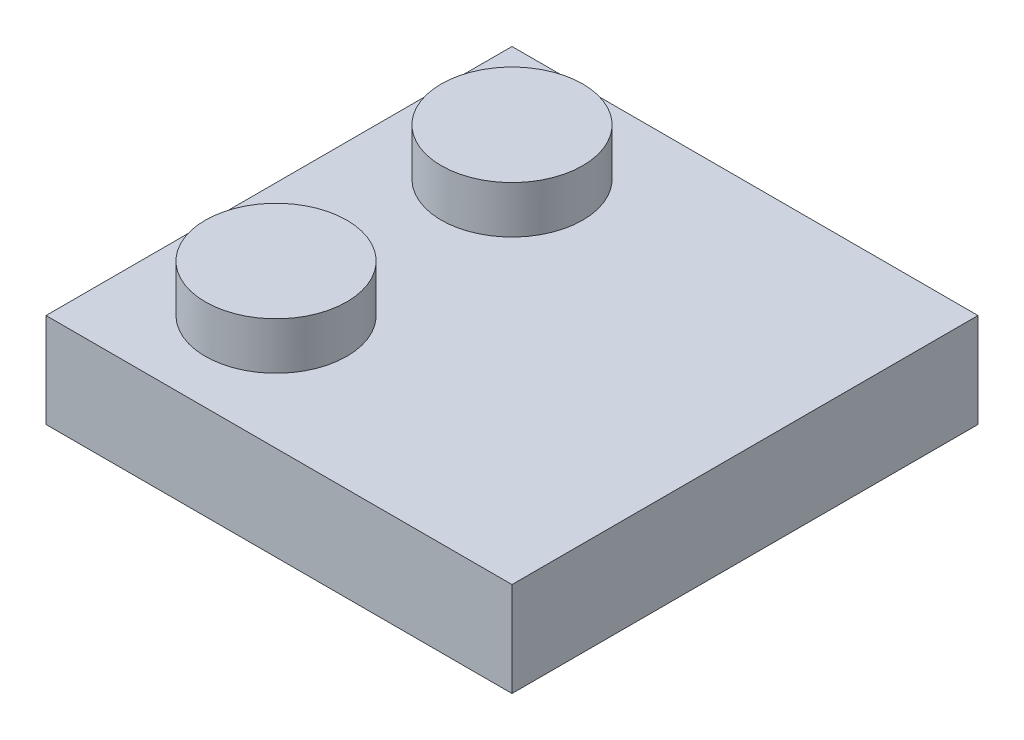
ISO-10303-21;
HEADER;
FILE_DESCRIPTION(('STEP AP214'),'2;1');
FILE_NAME('part.step','',(''),(''),'','','');
FILE_SCHEMA(('AUTOMOTIVE_DESIGN { 1 0 10303 214 1 1 1 1 }'));
ENDSEC;
DATA;
#1=APPLICATION_CONTEXT('core data for automotive mechanical design processes');
#2=APPLICATION_PROTOCOL_DEFINITION('international standard','automotive_design',2000,#1);
#3=PRODUCT_CONTEXT('',#1,'mechanical');
#4=PRODUCT('Part','Part','',(#3));
#5=PRODUCT_RELATED_PRODUCT_CATEGORY('part','',(#4));
#6=PRODUCT_DEFINITION_FORMATION('','',#4);
#7=PRODUCT_DEFINITION_CONTEXT('part definition',#1,'design');
#8=PRODUCT_DEFINITION('design','',#6,#7);
#9=PRODUCT_DEFINITION_SHAPE('','',#8);
#10=(LENGTH_UNIT() NAMED_UNIT(*) SI_UNIT(.MILLI.,.METRE.));
#11=(NAMED_UNIT(*) PLANE_ANGLE_UNIT() SI_UNIT($,.RADIAN.));
#12=(NAMED_UNIT(*) SI_UNIT($,.STERADIAN.) SOLID_ANGLE_UNIT());
#13=UNCERTAINTY_MEASURE_WITH_UNIT(LENGTH_MEASURE(1.E-05),#10,'distance_accuracy_value','');
#14=(GEOMETRIC_REPRESENTATION_CONTEXT(3) GLOBAL_UNCERTAINTY_ASSIGNED_CONTEXT((#13)) GLOBAL_UNIT_ASSIGNED_CONTEXT((#10,
#11,#12)) REPRESENTATION_CONTEXT('',''));
#15=CARTESIAN_POINT('',(0.,0.,0.));
#16=DIRECTION('',(0.,0.,1.));
#17=DIRECTION('',(1.,0.,0.));
#18=AXIS2_PLACEMENT_3D('',#15,#16,#17);
#19=CARTESIAN_POINT('',(0.681967213114738,0.,7.9));
#20=DIRECTION('',(0.,1.,0.));
#21=DIRECTION('',(0.,0.,1.));
#22=AXIS2_PLACEMENT_3D('',#19,#20,#21);
#23=PLANE('',#22);
#24=DIRECTION('',(1.,0.,0.));
#25=VECTOR('',#24,1.);
#26=CARTESIAN_POINT('',(0.681967213114738,0.,-7.9));
#27=LINE('',#26,#25);
#28=CARTESIAN_POINT('',(0.681967213114738,0.,-7.9));
#29=VERTEX_POINT('',#28);
#30=CARTESIAN_POINT('',(16.4819672131147,0.,-7.9));
#31=VERTEX_POINT('',#30);
#32=EDGE_CURVE('E187',#29,#31,#27,.T.);
#33=ORIENTED_EDGE('',*,*,#32,.T.);
#34=DIRECTION('',(0.,0.,-1.));
#35=VECTOR('',#34,1.);
#36=CARTESIAN_POINT('',(16.4819672131147,0.,7.9));
#37=LINE('',#36,#35);
#38=CARTESIAN_POINT('',(16.4819672131147,0.,7.9));
#39=VERTEX_POINT('',#38);
#40=EDGE_CURVE('E195',#39,#31,#37,.T.);
#41=ORIENTED_EDGE('',*,*,#40,.F.);
#42=DIRECTION('',(1.,0.,0.));
#43=VECTOR('',#42,1.);
#44=CARTESIAN_POINT('',(0.681967213114738,0.,7.9));
#45=LINE('',#44,#43);
#46=CARTESIAN_POINT('',(0.681967213114738,0.,7.9));
#47=VERTEX_POINT('',#46);
#48=EDGE_CURVE('E95',#47,#39,#45,.T.);
#49=ORIENTED_EDGE('',*,*,#48,.F.);
#50=DIRECTION('',(0.,0.,-1.));
#51=VECTOR('',#50,1.);
#52=CARTESIAN_POINT('',(0.681967213114738,0.,7.9));
#53=LINE('',#52,#51);
#54=EDGE_CURVE('E198',#47,#29,#53,.T.);
#55=ORIENTED_EDGE('',*,*,#54,.T.);
#56=EDGE_LOOP('',(#33,#41,#49,#55));
#57=FACE_BOUND('',#56,.T.);
#58=DIRECTION('',(1.,0.,0.));
#59=VECTOR('',#58,1.);
#60=CARTESIAN_POINT('',(0.,0.,-6.7));
#61=LINE('',#60,#59);
#62=CARTESIAN_POINT('',(1.88196721311474,0.,-6.7));
#63=VERTEX_POINT('',#62);
#64=CARTESIAN_POINT('',(15.2819672131147,0.,-6.7));
#65=VERTEX_POINT('',#64);
#66=EDGE_CURVE('E139',#63,#65,#61,.T.);
#67=ORIENTED_EDGE('',*,*,#66,.F.);
#68=DIRECTION('',(0.,0.,-1.));
#69=VECTOR('',#68,1.);
#70=CARTESIAN_POINT('',(1.88196721311474,0.,7.9));
#71=LINE('',#70,#69);
#72=CARTESIAN_POINT('',(1.88196721311474,0.,6.7));
#73=VERTEX_POINT('',#72);
#74=EDGE_CURVE('E138',#73,#63,#71,.T.);
#75=ORIENTED_EDGE('',*,*,#74,.F.);
#76=DIRECTION('',(1.,0.,0.));
#77=VECTOR('',#76,1.);
#78=CARTESIAN_POINT('',(0.,0.,6.7));
#79=LINE('',#78,#77);
#80=CARTESIAN_POINT('',(15.2819672131147,0.,6.7));
#81=VERTEX_POINT('',#80);
#82=EDGE_CURVE('E150',#73,#81,#79,.T.);
#83=ORIENTED_EDGE('',*,*,#82,.T.);
#84=DIRECTION('',(0.,0.,-1.));
#85=VECTOR('',#84,1.);
#86=CARTESIAN_POINT('',(15.2819672131147,0.,7.9));
#87=LINE('',#86,#85);
#88=EDGE_CURVE('E162',#81,#65,#87,.T.);
#89=ORIENTED_EDGE('',*,*,#88,.T.);
#90=EDGE_LOOP('',(#67,#75,#83,#89));
#91=FACE_BOUND('',#90,.T.);
#92=ADVANCED_FACE('F41',(#57,#91),#23,.F.);
#93=CARTESIAN_POINT('',(0.681967213114738,0.,7.9));
#94=DIRECTION('',(1.,0.,0.));
#95=DIRECTION('',(0.,0.,-1.));
#96=AXIS2_PLACEMENT_3D('',#93,#94,#95);
#97=PLANE('',#96);
#98=DIRECTION('',(0.,-1.,0.));
#99=VECTOR('',#98,1.);
#100=CARTESIAN_POINT('',(0.681967213114738,0.,-7.9));
#101=LINE('',#100,#99);
#102=CARTESIAN_POINT('',(0.681967213114738,3.2,-7.9));
#103=VERTEX_POINT('',#102);
#104=EDGE_CURVE('E177',#103,#29,#101,.T.);
#105=ORIENTED_EDGE('',*,*,#104,.T.);
#106=ORIENTED_EDGE('',*,*,#54,.F.);
#107=DIRECTION('',(0.,-1.,0.));
#108=VECTOR('',#107,1.);
#109=CARTESIAN_POINT('',(0.681967213114738,0.,7.9));
#110=LINE('',#109,#108);
#111=CARTESIAN_POINT('',(0.681967213114738,3.2,7.9));
#112=VERTEX_POINT('',#111);
#113=EDGE_CURVE('E178',#112,#47,#110,.T.);
#114=ORIENTED_EDGE('',*,*,#113,.F.);
#115=DIRECTION('',(0.,0.,-1.));
#116=VECTOR('',#115,1.);
#117=CARTESIAN_POINT('',(0.681967213114738,3.2,7.9));
#118=LINE('',#117,#116);
#119=EDGE_CURVE('E184',#112,#103,#118,.T.);
#120=ORIENTED_EDGE('',*,*,#119,.T.);
#121=EDGE_LOOP('',(#105,#106,#114,#120));
#122=FACE_BOUND('',#121,.T.);
#123=ADVANCED_FACE('F43',(#122),#97,.F.);
#124=CARTESIAN_POINT('',(16.4819672131147,0.,7.9));
#125=DIRECTION('',(-1.,0.,0.));
#126=DIRECTION('',(0.,0.,1.));
#127=AXIS2_PLACEMENT_3D('',#124,#125,#126);
#128=PLANE('',#127);
#129=DIRECTION('',(0.,1.,0.));
#130=VECTOR('',#129,1.);
#131=CARTESIAN_POINT('',(16.4819672131147,0.,-7.9));
#132=LINE('',#131,#130);
#133=CARTESIAN_POINT('',(16.4819672131147,3.2,-7.9));
#134=VERTEX_POINT('',#133);
#135=EDGE_CURVE('E189',#31,#134,#132,.T.);
#136=ORIENTED_EDGE('',*,*,#135,.T.);
#137=DIRECTION('',(0.,0.,-1.));
#138=VECTOR('',#137,1.);
#139=CARTESIAN_POINT('',(16.4819672131147,3.2,7.9));
#140=LINE('',#139,#138);
#141=CARTESIAN_POINT('',(16.4819672131147,3.2,7.9));
#142=VERTEX_POINT('',#141);
#143=EDGE_CURVE('E193',#142,#134,#140,.T.);
#144=ORIENTED_EDGE('',*,*,#143,.F.);
#145=DIRECTION('',(0.,1.,0.));
#146=VECTOR('',#145,1.);
#147=CARTESIAN_POINT('',(16.4819672131147,0.,7.9));
#148=LINE('',#147,#146);
#149=EDGE_CURVE('E181',#39,#142,#148,.T.);
#150=ORIENTED_EDGE('',*,*,#149,.F.);
#151=ORIENTED_EDGE('',*,*,#40,.T.);
#152=EDGE_LOOP('',(#136,#144,#150,#151));
#153=FACE_BOUND('',#152,.T.);
#154=ADVANCED_FACE('F212',(#153),#128,.F.);
#155=CARTESIAN_POINT('',(0.681967213114738,3.2,7.9));
#156=DIRECTION('',(0.,-1.,0.));
#157=DIRECTION('',(1.,0.,0.));
#158=AXIS2_PLACEMENT_3D('',#155,#156,#157);
#159=PLANE('',#158);
#160=CARTESIAN_POINT('',(4.58196721311474,3.2,4.));
#161=DIRECTION('',(0.,-1.,0.));
#162=DIRECTION('',(1.,0.,0.));
#163=AXIS2_PLACEMENT_3D('',#160,#161,#162);
#164=CIRCLE('',#163,2.4);
#165=CARTESIAN_POINT('',(6.98196721311474,3.2,4.));
#166=VERTEX_POINT('',#165);
#167=EDGE_CURVE('E50',#166,#166,#164,.F.);
#168=ORIENTED_EDGE('',*,*,#167,.F.);
#169=EDGE_LOOP('',(#168));
#170=FACE_BOUND('',#169,.T.);
#171=CARTESIAN_POINT('',(4.58196721311474,3.2,-4.));
#172=DIRECTION('',(0.,-1.,0.));
#173=DIRECTION('',(1.,0.,0.));
#174=AXIS2_PLACEMENT_3D('',#171,#172,#173);
#175=CIRCLE('',#174,2.4);
#176=CARTESIAN_POINT('',(6.98196721311474,3.2,-4.));
#177=VERTEX_POINT('',#176);
#178=EDGE_CURVE('E200',#177,#177,#175,.F.);
#179=ORIENTED_EDGE('',*,*,#178,.F.);
#180=EDGE_LOOP('',(#179));
#181=FACE_BOUND('',#180,.T.);
#182=DIRECTION('',(-1.,0.,0.));
#183=VECTOR('',#182,1.);
#184=CARTESIAN_POINT('',(0.681967213114738,3.2,-7.9));
#185=LINE('',#184,#183);
#186=EDGE_CURVE('E87',#134,#103,#185,.T.);
#187=ORIENTED_EDGE('',*,*,#186,.T.);
#188=ORIENTED_EDGE('',*,*,#119,.F.);
#189=DIRECTION('',(-1.,0.,0.));
#190=VECTOR('',#189,1.);
#191=CARTESIAN_POINT('',(0.681967213114738,3.2,7.9));
#192=LINE('',#191,#190);
#193=EDGE_CURVE('E66',#142,#112,#192,.T.);
#194=ORIENTED_EDGE('',*,*,#193,.F.);
#195=ORIENTED_EDGE('',*,*,#143,.T.);
#196=EDGE_LOOP('',(#187,#188,#194,#195));
#197=FACE_BOUND('',#196,.T.);
#198=ADVANCED_FACE('F208',(#170,#181,#197),#159,.F.);
#199=CARTESIAN_POINT('',(0.,0.,7.9));
#200=DIRECTION('',(0.,0.,-1.));
#201=DIRECTION('',(-1.,0.,0.));
#202=AXIS2_PLACEMENT_3D('',#199,#200,#201);
#203=PLANE('',#202);
#204=ORIENTED_EDGE('',*,*,#113,.T.);
#205=ORIENTED_EDGE('',*,*,#48,.T.);
#206=ORIENTED_EDGE('',*,*,#149,.T.);
#207=ORIENTED_EDGE('',*,*,#193,.T.);
#208=EDGE_LOOP('',(#204,#205,#206,#207));
#209=FACE_BOUND('',#208,.T.);
#210=ADVANCED_FACE('F211',(#209),#203,.F.);
#211=CARTESIAN_POINT('',(0.,0.,-7.9));
#212=DIRECTION('',(0.,0.,-1.));
#213=DIRECTION('',(-1.,0.,0.));
#214=AXIS2_PLACEMENT_3D('',#211,#212,#213);
#215=PLANE('',#214);
#216=ORIENTED_EDGE('',*,*,#104,.F.);
#217=ORIENTED_EDGE('',*,*,#186,.F.);
#218=ORIENTED_EDGE('',*,*,#135,.F.);
#219=ORIENTED_EDGE('',*,*,#32,.F.);
#220=EDGE_LOOP('',(#216,#217,#218,#219));
#221=FACE_BOUND('',#220,.T.);
#222=ADVANCED_FACE('F219',(#221),#215,.T.);
#223=CARTESIAN_POINT('',(4.58196721311474,4.8,-4.));
#224=DIRECTION('',(0.,-1.,0.));
#225=DIRECTION('',(0.,0.,-1.));
#226=AXIS2_PLACEMENT_3D('',#223,#224,#225);
#227=CYLINDRICAL_SURFACE('',#226,2.4);
#228=CARTESIAN_POINT('',(4.58196721311474,4.8,-4.));
#229=DIRECTION('',(0.,1.,0.));
#230=DIRECTION('',(0.,0.,1.));
#231=AXIS2_PLACEMENT_3D('',#228,#229,#230);
#232=CIRCLE('',#231,2.4);
#233=CARTESIAN_POINT('',(4.58196721311474,4.8,-1.6));
#234=VERTEX_POINT('',#233);
#235=EDGE_CURVE('E174',#234,#234,#232,.T.);
#236=ORIENTED_EDGE('',*,*,#235,.F.);
#237=EDGE_LOOP('',(#236));
#238=FACE_BOUND('',#237,.T.);
#239=ORIENTED_EDGE('',*,*,#178,.T.);
#240=EDGE_LOOP('',(#239));
#241=FACE_BOUND('',#240,.T.);
#242=ADVANCED_FACE('F216',(#238,#241),#227,.T.);
#243=CARTESIAN_POINT('',(4.58196721311474,4.8,-4.));
#244=DIRECTION('',(0.,1.,0.));
#245=DIRECTION('',(0.,0.,1.));
#246=AXIS2_PLACEMENT_3D('',#243,#244,#245);
#247=PLANE('',#246);
#248=ORIENTED_EDGE('',*,*,#235,.T.);
#249=EDGE_LOOP('',(#248));
#250=FACE_BOUND('',#249,.T.);
#251=ADVANCED_FACE('F218',(#250),#247,.T.);
#252=CARTESIAN_POINT('',(4.58196721311474,4.8,4.));
#253=DIRECTION('',(0.,-1.,0.));
#254=DIRECTION('',(0.,0.,-1.));
#255=AXIS2_PLACEMENT_3D('',#252,#253,#254);
#256=CYLINDRICAL_SURFACE('',#255,2.4);
#257=CARTESIAN_POINT('',(4.58196721311474,4.8,4.));
#258=DIRECTION('',(0.,1.,0.));
#259=DIRECTION('',(0.,0.,1.));
#260=AXIS2_PLACEMENT_3D('',#257,#258,#259);
#261=CIRCLE('',#260,2.4);
#262=CARTESIAN_POINT('',(4.58196721311474,4.8,6.4));
#263=VERTEX_POINT('',#262);
#264=EDGE_CURVE('E155',#263,#263,#261,.T.);
#265=ORIENTED_EDGE('',*,*,#264,.F.);
#266=EDGE_LOOP('',(#265));
#267=FACE_BOUND('',#266,.T.);
#268=ORIENTED_EDGE('',*,*,#167,.T.);
#269=EDGE_LOOP('',(#268));
#270=FACE_BOUND('',#269,.T.);
#271=ADVANCED_FACE('F206',(#267,#270),#256,.T.);
#272=CARTESIAN_POINT('',(4.58196721311474,4.8,4.));
#273=DIRECTION('',(0.,1.,0.));
#274=DIRECTION('',(0.,0.,1.));
#275=AXIS2_PLACEMENT_3D('',#272,#273,#274);
#276=PLANE('',#275);
#277=ORIENTED_EDGE('',*,*,#264,.T.);
#278=EDGE_LOOP('',(#277));
#279=FACE_BOUND('',#278,.T.);
#280=ADVANCED_FACE('F280',(#279),#276,.T.);
#281=CARTESIAN_POINT('',(1.88196721311474,0.,7.9));
#282=DIRECTION('',(1.,0.,0.));
#283=DIRECTION('',(0.,0.,-1.));
#284=AXIS2_PLACEMENT_3D('',#281,#282,#283);
#285=PLANE('',#284);
#286=DIRECTION('',(0.,-1.,0.));
#287=VECTOR('',#286,1.);
#288=CARTESIAN_POINT('',(1.88196721311474,0.,-6.7));
#289=LINE('',#288,#287);
#290=CARTESIAN_POINT('',(1.88196721311474,2.,-6.7));
#291=VERTEX_POINT('',#290);
#292=EDGE_CURVE('E122',#291,#63,#289,.T.);
#293=ORIENTED_EDGE('',*,*,#292,.F.);
#294=DIRECTION('',(0.,0.,-1.));
#295=VECTOR('',#294,1.);
#296=CARTESIAN_POINT('',(1.88196721311474,2.,7.9));
#297=LINE('',#296,#295);
#298=CARTESIAN_POINT('',(1.88196721311474,2.,6.7));
#299=VERTEX_POINT('',#298);
#300=EDGE_CURVE('E130',#299,#291,#297,.T.);
#301=ORIENTED_EDGE('',*,*,#300,.F.);
#302=DIRECTION('',(0.,-1.,0.));
#303=VECTOR('',#302,1.);
#304=CARTESIAN_POINT('',(1.88196721311474,0.,6.7));
#305=LINE('',#304,#303);
#306=EDGE_CURVE('E57',#299,#73,#305,.T.);
#307=ORIENTED_EDGE('',*,*,#306,.T.);
#308=ORIENTED_EDGE('',*,*,#74,.T.);
#309=EDGE_LOOP('',(#293,#301,#307,#308));
#310=FACE_BOUND('',#309,.T.);
#311=ADVANCED_FACE('F136',(#310),#285,.T.);
#312=CARTESIAN_POINT('',(15.2819672131147,0.,7.9));
#313=DIRECTION('',(-1.,0.,0.));
#314=DIRECTION('',(0.,0.,1.));
#315=AXIS2_PLACEMENT_3D('',#312,#313,#314);
#316=PLANE('',#315);
#317=DIRECTION('',(0.,1.,0.));
#318=VECTOR('',#317,1.);
#319=CARTESIAN_POINT('',(15.2819672131147,0.,-6.7));
#320=LINE('',#319,#318);
#321=CARTESIAN_POINT('',(15.2819672131147,2.,-6.7));
#322=VERTEX_POINT('',#321);
#323=EDGE_CURVE('E125',#65,#322,#320,.T.);
#324=ORIENTED_EDGE('',*,*,#323,.F.);
#325=ORIENTED_EDGE('',*,*,#88,.F.);
#326=DIRECTION('',(0.,1.,0.));
#327=VECTOR('',#326,1.);
#328=CARTESIAN_POINT('',(15.2819672131147,0.,6.7));
#329=LINE('',#328,#327);
#330=CARTESIAN_POINT('',(15.2819672131147,2.,6.7));
#331=VERTEX_POINT('',#330);
#332=EDGE_CURVE('E160',#81,#331,#329,.T.);
#333=ORIENTED_EDGE('',*,*,#332,.T.);
#334=DIRECTION('',(0.,0.,-1.));
#335=VECTOR('',#334,1.);
#336=CARTESIAN_POINT('',(15.2819672131147,2.,7.9));
#337=LINE('',#336,#335);
#338=EDGE_CURVE('E134',#331,#322,#337,.T.);
#339=ORIENTED_EDGE('',*,*,#338,.T.);
#340=EDGE_LOOP('',(#324,#325,#333,#339));
#341=FACE_BOUND('',#340,.T.);
#342=ADVANCED_FACE('F305',(#341),#316,.T.);
#343=CARTESIAN_POINT('',(0.681967213114738,2.,7.9));
#344=DIRECTION('',(0.,-1.,0.));
#345=DIRECTION('',(1.,0.,0.));
#346=AXIS2_PLACEMENT_3D('',#343,#344,#345);
#347=PLANE('',#346);
#348=CARTESIAN_POINT('',(8.58196721311474,2.,0.));
#349=DIRECTION('',(0.,-1.,0.));
#350=DIRECTION('',(1.,0.,0.));
#351=AXIS2_PLACEMENT_3D('',#348,#349,#350);
#352=CIRCLE('',#351,3.15);
#353=CARTESIAN_POINT('',(11.7319672131147,2.,0.));
#354=VERTEX_POINT('',#353);
#355=EDGE_CURVE('E45',#354,#354,#352,.F.);
#356=ORIENTED_EDGE('',*,*,#355,.T.);
#357=EDGE_LOOP('',(#356));
#358=FACE_BOUND('',#357,.T.);
#359=CARTESIAN_POINT('',(4.58196721311474,2.,4.));
#360=DIRECTION('',(0.,-1.,0.));
#361=DIRECTION('',(1.,0.,0.));
#362=AXIS2_PLACEMENT_3D('',#359,#360,#361);
#363=CIRCLE('',#362,1.2);
#364=CARTESIAN_POINT('',(5.78196721311474,2.,4.));
#365=VERTEX_POINT('',#364);
#366=EDGE_CURVE('E152',#365,#365,#363,.F.);
#367=ORIENTED_EDGE('',*,*,#366,.T.);
#368=EDGE_LOOP('',(#367));
#369=FACE_BOUND('',#368,.T.);
#370=CARTESIAN_POINT('',(4.58196721311474,2.,-4.));
#371=DIRECTION('',(0.,-1.,0.));
#372=DIRECTION('',(1.,0.,0.));
#373=AXIS2_PLACEMENT_3D('',#370,#371,#372);
#374=CIRCLE('',#373,1.2);
#375=CARTESIAN_POINT('',(5.78196721311474,2.,-4.));
#376=VERTEX_POINT('',#375);
#377=EDGE_CURVE('E156',#376,#376,#374,.F.);
#378=ORIENTED_EDGE('',*,*,#377,.T.);
#379=EDGE_LOOP('',(#378));
#380=FACE_BOUND('',#379,.T.);
#381=DIRECTION('',(-1.,0.,0.));
#382=VECTOR('',#381,1.);
#383=CARTESIAN_POINT('',(0.,2.,-6.7));
#384=LINE('',#383,#382);
#385=EDGE_CURVE('E118',#322,#291,#384,.T.);
#386=ORIENTED_EDGE('',*,*,#385,.F.);
#387=ORIENTED_EDGE('',*,*,#338,.F.);
#388=DIRECTION('',(-1.,0.,0.));
#389=VECTOR('',#388,1.);
#390=CARTESIAN_POINT('',(0.,2.,6.7));
#391=LINE('',#390,#389);
#392=EDGE_CURVE('E133',#331,#299,#391,.T.);
#393=ORIENTED_EDGE('',*,*,#392,.T.);
#394=ORIENTED_EDGE('',*,*,#300,.T.);
#395=EDGE_LOOP('',(#386,#387,#393,#394));
#396=FACE_BOUND('',#395,.T.);
#397=ADVANCED_FACE('F131',(#358,#369,#380,#396),#347,.T.);
#398=CARTESIAN_POINT('',(0.,0.,6.7));
#399=DIRECTION('',(0.,0.,-1.));
#400=DIRECTION('',(-1.,0.,0.));
#401=AXIS2_PLACEMENT_3D('',#398,#399,#400);
#402=PLANE('',#401);
#403=ORIENTED_EDGE('',*,*,#306,.F.);
#404=ORIENTED_EDGE('',*,*,#392,.F.);
#405=ORIENTED_EDGE('',*,*,#332,.F.);
#406=ORIENTED_EDGE('',*,*,#82,.F.);
#407=EDGE_LOOP('',(#403,#404,#405,#406));
#408=FACE_BOUND('',#407,.T.);
#409=ADVANCED_FACE('F325',(#408),#402,.T.);
#410=CARTESIAN_POINT('',(0.,0.,-6.7));
#411=DIRECTION('',(0.,0.,-1.));
#412=DIRECTION('',(-1.,0.,0.));
#413=AXIS2_PLACEMENT_3D('',#410,#411,#412);
#414=PLANE('',#413);
#415=ORIENTED_EDGE('',*,*,#292,.T.);
#416=ORIENTED_EDGE('',*,*,#66,.T.);
#417=ORIENTED_EDGE('',*,*,#323,.T.);
#418=ORIENTED_EDGE('',*,*,#385,.T.);
#419=EDGE_LOOP('',(#415,#416,#417,#418));
#420=FACE_BOUND('',#419,.T.);
#421=ADVANCED_FACE('F120',(#420),#414,.F.);
#422=CARTESIAN_POINT('',(4.58196721311474,4.8,-4.));
#423=DIRECTION('',(0.,-1.,0.));
#424=DIRECTION('',(0.,0.,-1.));
#425=AXIS2_PLACEMENT_3D('',#422,#423,#424);
#426=CYLINDRICAL_SURFACE('',#425,1.2);
#427=CARTESIAN_POINT('',(4.58196721311474,3.6,-4.));
#428=DIRECTION('',(0.,1.,0.));
#429=DIRECTION('',(0.,0.,1.));
#430=AXIS2_PLACEMENT_3D('',#427,#428,#429);
#431=CIRCLE('',#430,1.2);
#432=CARTESIAN_POINT('',(4.58196721311474,3.6,-2.8));
#433=VERTEX_POINT('',#432);
#434=EDGE_CURVE('E140',#433,#433,#431,.T.);
#435=ORIENTED_EDGE('',*,*,#434,.T.);
#436=EDGE_LOOP('',(#435));
#437=FACE_BOUND('',#436,.T.);
#438=ORIENTED_EDGE('',*,*,#377,.F.);
#439=EDGE_LOOP('',(#438));
#440=FACE_BOUND('',#439,.T.);
#441=ADVANCED_FACE('F344',(#437,#440),#426,.F.);
#442=CARTESIAN_POINT('',(4.58196721311474,3.6,-4.));
#443=DIRECTION('',(0.,1.,0.));
#444=DIRECTION('',(0.,0.,1.));
#445=AXIS2_PLACEMENT_3D('',#442,#443,#444);
#446=PLANE('',#445);
#447=ORIENTED_EDGE('',*,*,#434,.F.);
#448=EDGE_LOOP('',(#447));
#449=FACE_BOUND('',#448,.T.);
#450=ADVANCED_FACE('F353',(#449),#446,.F.);
#451=CARTESIAN_POINT('',(4.58196721311474,4.8,4.));
#452=DIRECTION('',(0.,-1.,0.));
#453=DIRECTION('',(0.,0.,-1.));
#454=AXIS2_PLACEMENT_3D('',#451,#452,#453);
#455=CYLINDRICAL_SURFACE('',#454,1.2);
#456=CARTESIAN_POINT('',(4.58196721311474,3.6,4.));
#457=DIRECTION('',(0.,1.,0.));
#458=DIRECTION('',(0.,0.,1.));
#459=AXIS2_PLACEMENT_3D('',#456,#457,#458);
#460=CIRCLE('',#459,1.2);
#461=CARTESIAN_POINT('',(4.58196721311474,3.6,5.2));
#462=VERTEX_POINT('',#461);
#463=EDGE_CURVE('E144',#462,#462,#460,.T.);
#464=ORIENTED_EDGE('',*,*,#463,.T.);
#465=EDGE_LOOP('',(#464));
#466=FACE_BOUND('',#465,.T.);
#467=ORIENTED_EDGE('',*,*,#366,.F.);
#468=EDGE_LOOP('',(#467));
#469=FACE_BOUND('',#468,.T.);
#470=ADVANCED_FACE('F363',(#466,#469),#455,.F.);
#471=CARTESIAN_POINT('',(4.58196721311474,3.6,4.));
#472=DIRECTION('',(0.,1.,0.));
#473=DIRECTION('',(0.,0.,1.));
#474=AXIS2_PLACEMENT_3D('',#471,#472,#473);
#475=PLANE('',#474);
#476=ORIENTED_EDGE('',*,*,#463,.F.);
#477=EDGE_LOOP('',(#476));
#478=FACE_BOUND('',#477,.T.);
#479=ADVANCED_FACE('F373',(#478),#475,.F.);
#480=CARTESIAN_POINT('',(8.58196721311474,0.6,0.));
#481=DIRECTION('',(0.,-1.,0.));
#482=DIRECTION('',(0.,0.,-1.));
#483=AXIS2_PLACEMENT_3D('',#480,#481,#482);
#484=PLANE('',#483);
#485=CARTESIAN_POINT('',(8.58196721311474,0.6,0.));
#486=DIRECTION('',(0.,-1.,0.));
#487=DIRECTION('',(0.,0.,-1.));
#488=AXIS2_PLACEMENT_3D('',#485,#486,#487);
#489=CIRCLE('',#488,3.15);
#490=CARTESIAN_POINT('',(8.58196721311474,0.6,-3.15));
#491=VERTEX_POINT('',#490);
#492=EDGE_CURVE('E148',#491,#491,#489,.T.);
#493=ORIENTED_EDGE('',*,*,#492,.T.);
#494=EDGE_LOOP('',(#493));
#495=FACE_BOUND('',#494,.T.);
#496=CARTESIAN_POINT('',(8.58196721311474,0.6,0.));
#497=DIRECTION('',(0.,-1.,0.));
#498=DIRECTION('',(0.,0.,-1.));
#499=AXIS2_PLACEMENT_3D('',#496,#497,#498);
#500=CIRCLE('',#499,2.4);
#501=CARTESIAN_POINT('',(8.58196721311474,0.6,-2.4));
#502=VERTEX_POINT('',#501);
#503=EDGE_CURVE('E445',#502,#502,#500,.T.);
#504=ORIENTED_EDGE('',*,*,#503,.F.);
#505=EDGE_LOOP('',(#504));
#506=FACE_BOUND('',#505,.T.);
#507=ADVANCED_FACE('F383',(#495,#506),#484,.T.);
#508=CARTESIAN_POINT('',(8.58196721311474,0.6,0.));
#509=DIRECTION('',(0.,1.,0.));
#510=DIRECTION('',(0.,0.,1.));
#511=AXIS2_PLACEMENT_3D('',#508,#509,#510);
#512=CYLINDRICAL_SURFACE('',#511,3.15);
#513=ORIENTED_EDGE('',*,*,#355,.F.);
#514=EDGE_LOOP('',(#513));
#515=FACE_BOUND('',#514,.T.);
#516=ORIENTED_EDGE('',*,*,#492,.F.);
#517=EDGE_LOOP('',(#516));
#518=FACE_BOUND('',#517,.T.);
#519=ADVANCED_FACE('F401',(#515,#518),#512,.T.);
#520=CARTESIAN_POINT('',(8.58196721311474,0.6,0.));
#521=DIRECTION('',(0.,1.,0.));
#522=DIRECTION('',(0.,0.,1.));
#523=AXIS2_PLACEMENT_3D('',#520,#521,#522);
#524=CYLINDRICAL_SURFACE('',#523,2.4);
#525=CARTESIAN_POINT('',(8.58196721311474,2.,0.));
#526=DIRECTION('',(0.,-1.,0.));
#527=DIRECTION('',(1.,0.,0.));
#528=AXIS2_PLACEMENT_3D('',#525,#526,#527);
#529=CIRCLE('',#528,2.4);
#530=CARTESIAN_POINT('',(10.9819672131147,2.,0.));
#531=VERTEX_POINT('',#530);
#532=EDGE_CURVE('E11',#531,#531,#529,.F.);
#533=ORIENTED_EDGE('',*,*,#532,.T.);
#534=EDGE_LOOP('',(#533));
#535=FACE_BOUND('',#534,.T.);
#536=ORIENTED_EDGE('',*,*,#503,.T.);
#537=EDGE_LOOP('',(#536));
#538=FACE_BOUND('',#537,.T.);
#539=ADVANCED_FACE('F392',(#535,#538),#524,.F.);
#540=ORIENTED_EDGE('',*,*,#532,.F.);
#541=EDGE_LOOP('',(#540));
#542=FACE_BOUND('',#541,.T.);
#543=ADVANCED_FACE('F328',(#542),#347,.T.);
#544=CLOSED_SHELL('',(#92,#123,#154,#198,#210,#222,#242,#251,#271,#280,#311,#342,#397,#409,#421,
#441,#450,#470,#479,#507,#519,#539,#543));
#545=MANIFOLD_SOLID_BREP('B2',#544);
#546=ADVANCED_BREP_SHAPE_REPRESENTATION('',(#18,#545),#14);
#547=SHAPE_DEFINITION_REPRESENTATION(#9,#546);
ENDSEC;
END-ISO-10303-21;
